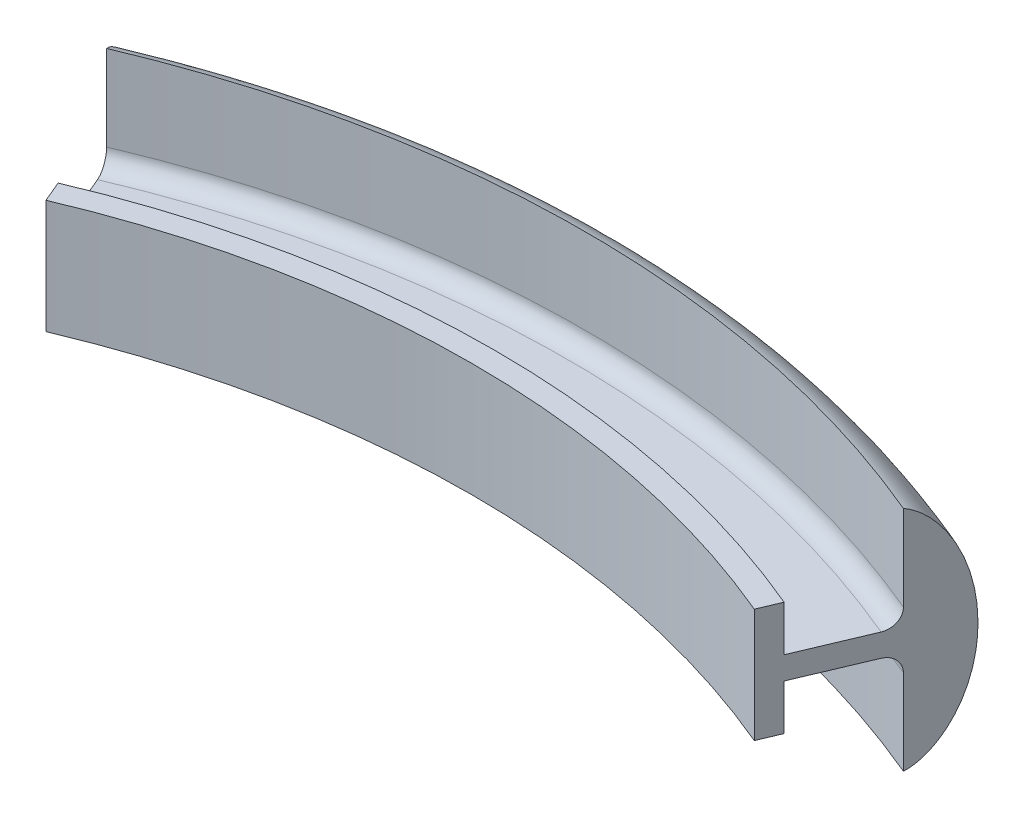
ISO-10303-21;
HEADER;
FILE_DESCRIPTION(('STEP AP214'),'2;1');
FILE_NAME('part.step','',(''),(''),'','','');
FILE_SCHEMA(('AUTOMOTIVE_DESIGN { 1 0 10303 214 1 1 1 1 }'));
ENDSEC;
DATA;
#1=APPLICATION_CONTEXT('core data for automotive mechanical design processes');
#2=APPLICATION_PROTOCOL_DEFINITION('international standard','automotive_design',2000,#1);
#3=PRODUCT_CONTEXT('',#1,'mechanical');
#4=PRODUCT('Part','Part','',(#3));
#5=PRODUCT_RELATED_PRODUCT_CATEGORY('part','',(#4));
#6=PRODUCT_DEFINITION_FORMATION('','',#4);
#7=PRODUCT_DEFINITION_CONTEXT('part definition',#1,'design');
#8=PRODUCT_DEFINITION('design','',#6,#7);
#9=PRODUCT_DEFINITION_SHAPE('','',#8);
#10=(LENGTH_UNIT() NAMED_UNIT(*) SI_UNIT(.MILLI.,.METRE.));
#11=(NAMED_UNIT(*) PLANE_ANGLE_UNIT() SI_UNIT($,.RADIAN.));
#12=(NAMED_UNIT(*) SI_UNIT($,.STERADIAN.) SOLID_ANGLE_UNIT());
#13=UNCERTAINTY_MEASURE_WITH_UNIT(LENGTH_MEASURE(1.E-05),#10,'distance_accuracy_value','');
#14=(GEOMETRIC_REPRESENTATION_CONTEXT(3) GLOBAL_UNCERTAINTY_ASSIGNED_CONTEXT((#13)) GLOBAL_UNIT_ASSIGNED_CONTEXT((#10,
#11,#12)) REPRESENTATION_CONTEXT('',''));
#15=CARTESIAN_POINT('',(0.,0.,0.));
#16=DIRECTION('',(0.,0.,1.));
#17=DIRECTION('',(1.,0.,0.));
#18=AXIS2_PLACEMENT_3D('',#15,#16,#17);
#19=CARTESIAN_POINT('',(-31.8888888888889,0.999999999999999,14.4546575530159));
#20=DIRECTION('',(0.,1.,0.));
#21=DIRECTION('',(0.,0.,1.));
#22=AXIS2_PLACEMENT_3D('',#19,#20,#21);
#23=PLANE('',#22);
#24=CARTESIAN_POINT('',(0.,0.999999999999998,90.));
#25=DIRECTION('',(0.,-1.,0.));
#26=DIRECTION('',(0.,0.,-1.));
#27=AXIS2_PLACEMENT_3D('',#24,#25,#26);
#28=CIRCLE('',#27,82.);
#29=CARTESIAN_POINT('',(-31.8888888888889,0.999999999999998,14.4546575530159));
#30=VERTEX_POINT('',#29);
#31=CARTESIAN_POINT('',(31.8888888888889,0.999999999999998,14.4546575530159));
#32=VERTEX_POINT('',#31);
#33=EDGE_CURVE('E12',#30,#32,#28,.T.);
#34=ORIENTED_EDGE('',*,*,#33,.T.);
#35=DIRECTION('',(-0.388888888888889,0.,0.921284663987611));
#36=VECTOR('',#35,1.);
#37=CARTESIAN_POINT('',(31.8888888888889,0.999999999999998,14.4546575530159));
#38=LINE('',#37,#36);
#39=CARTESIAN_POINT('',(34.4166666666667,0.999999999999999,8.46630723709643));
#40=VERTEX_POINT('',#39);
#41=EDGE_CURVE('E129',#40,#32,#38,.T.);
#42=ORIENTED_EDGE('',*,*,#41,.F.);
#43=CARTESIAN_POINT('',(0.,0.999999999999999,90.));
#44=DIRECTION('',(0.,-1.,0.));
#45=DIRECTION('',(0.,0.,-1.));
#46=AXIS2_PLACEMENT_3D('',#43,#44,#45);
#47=CIRCLE('',#46,88.5);
#48=CARTESIAN_POINT('',(-34.4166666666667,0.999999999999999,8.46630723709643));
#49=VERTEX_POINT('',#48);
#50=EDGE_CURVE('E50',#49,#40,#47,.T.);
#51=ORIENTED_EDGE('',*,*,#50,.F.);
#52=DIRECTION('',(0.388888888888889,0.,0.921284663987611));
#53=VECTOR('',#52,1.);
#54=CARTESIAN_POINT('',(-31.8888888888889,0.999999999999998,14.4546575530159));
#55=LINE('',#54,#53);
#56=EDGE_CURVE('E131',#49,#30,#55,.T.);
#57=ORIENTED_EDGE('',*,*,#56,.T.);
#58=EDGE_LOOP('',(#34,#42,#51,#57));
#59=FACE_BOUND('',#58,.T.);
#60=ADVANCED_FACE('F35',(#59),#23,.T.);
#61=CARTESIAN_POINT('',(0.,0.,90.));
#62=DIRECTION('',(0.,-1.,0.));
#63=DIRECTION('',(0.,0.,-1.));
#64=AXIS2_PLACEMENT_3D('',#61,#62,#63);
#65=CYLINDRICAL_SURFACE('',#64,82.);
#66=CARTESIAN_POINT('',(0.,5.,90.));
#67=DIRECTION('',(0.,-1.,0.));
#68=DIRECTION('',(0.,0.,-1.));
#69=AXIS2_PLACEMENT_3D('',#66,#67,#68);
#70=CIRCLE('',#69,82.);
#71=CARTESIAN_POINT('',(-31.8888888888889,5.,14.4546575530159));
#72=VERTEX_POINT('',#71);
#73=CARTESIAN_POINT('',(31.8888888888889,5.,14.4546575530159));
#74=VERTEX_POINT('',#73);
#75=EDGE_CURVE('E43',#72,#74,#70,.T.);
#76=ORIENTED_EDGE('',*,*,#75,.T.);
#77=DIRECTION('',(0.,1.,0.));
#78=VECTOR('',#77,1.);
#79=CARTESIAN_POINT('',(31.8888888888889,5.,14.4546575530159));
#80=LINE('',#79,#78);
#81=EDGE_CURVE('E140',#32,#74,#80,.T.);
#82=ORIENTED_EDGE('',*,*,#81,.F.);
#83=ORIENTED_EDGE('',*,*,#33,.F.);
#84=DIRECTION('',(0.,1.,0.));
#85=VECTOR('',#84,1.);
#86=CARTESIAN_POINT('',(-31.8888888888889,5.,14.4546575530159));
#87=LINE('',#86,#85);
#88=EDGE_CURVE('E187',#30,#72,#87,.T.);
#89=ORIENTED_EDGE('',*,*,#88,.T.);
#90=EDGE_LOOP('',(#76,#82,#83,#89));
#91=FACE_BOUND('',#90,.T.);
#92=ADVANCED_FACE('F37',(#91),#65,.T.);
#93=CARTESIAN_POINT('',(-31.1111111111111,5.,16.2972268809911));
#94=DIRECTION('',(0.,1.,0.));
#95=DIRECTION('',(0.,0.,1.));
#96=AXIS2_PLACEMENT_3D('',#93,#94,#95);
#97=PLANE('',#96);
#98=CARTESIAN_POINT('',(0.,5.,90.));
#99=DIRECTION('',(0.,-1.,0.));
#100=DIRECTION('',(0.,0.,-1.));
#101=AXIS2_PLACEMENT_3D('',#98,#99,#100);
#102=CIRCLE('',#101,80.);
#103=CARTESIAN_POINT('',(-31.1111111111111,5.,16.2972268809911));
#104=VERTEX_POINT('',#103);
#105=CARTESIAN_POINT('',(31.1111111111111,5.,16.2972268809911));
#106=VERTEX_POINT('',#105);
#107=EDGE_CURVE('E304',#104,#106,#102,.T.);
#108=ORIENTED_EDGE('',*,*,#107,.T.);
#109=DIRECTION('',(-0.388888888888889,0.,0.921284663987611));
#110=VECTOR('',#109,1.);
#111=CARTESIAN_POINT('',(31.1111111111111,5.,16.2972268809911));
#112=LINE('',#111,#110);
#113=EDGE_CURVE('E145',#74,#106,#112,.T.);
#114=ORIENTED_EDGE('',*,*,#113,.F.);
#115=ORIENTED_EDGE('',*,*,#75,.F.);
#116=DIRECTION('',(0.388888888888889,0.,0.921284663987611));
#117=VECTOR('',#116,1.);
#118=CARTESIAN_POINT('',(-31.1111111111111,5.,16.2972268809911));
#119=LINE('',#118,#117);
#120=EDGE_CURVE('E189',#72,#104,#119,.T.);
#121=ORIENTED_EDGE('',*,*,#120,.T.);
#122=EDGE_LOOP('',(#108,#114,#115,#121));
#123=FACE_BOUND('',#122,.T.);
#124=ADVANCED_FACE('F254',(#123),#97,.T.);
#125=CARTESIAN_POINT('',(0.,0.,90.));
#126=DIRECTION('',(0.,-1.,0.));
#127=DIRECTION('',(0.,0.,-1.));
#128=AXIS2_PLACEMENT_3D('',#125,#126,#127);
#129=CYLINDRICAL_SURFACE('',#128,80.);
#130=CARTESIAN_POINT('',(0.,-5.,90.));
#131=DIRECTION('',(0.,-1.,0.));
#132=DIRECTION('',(0.,0.,-1.));
#133=AXIS2_PLACEMENT_3D('',#130,#131,#132);
#134=CIRCLE('',#133,80.);
#135=CARTESIAN_POINT('',(-31.1111111111111,-5.,16.2972268809911));
#136=VERTEX_POINT('',#135);
#137=CARTESIAN_POINT('',(31.1111111111111,-5.,16.2972268809911));
#138=VERTEX_POINT('',#137);
#139=EDGE_CURVE('E302',#136,#138,#134,.T.);
#140=ORIENTED_EDGE('',*,*,#139,.T.);
#141=DIRECTION('',(0.,-1.,0.));
#142=VECTOR('',#141,1.);
#143=CARTESIAN_POINT('',(31.1111111111111,-5.,16.2972268809911));
#144=LINE('',#143,#142);
#145=EDGE_CURVE('E147',#106,#138,#144,.T.);
#146=ORIENTED_EDGE('',*,*,#145,.F.);
#147=ORIENTED_EDGE('',*,*,#107,.F.);
#148=DIRECTION('',(0.,-1.,0.));
#149=VECTOR('',#148,1.);
#150=CARTESIAN_POINT('',(-31.1111111111111,-5.,16.2972268809911));
#151=LINE('',#150,#149);
#152=EDGE_CURVE('E192',#104,#136,#151,.T.);
#153=ORIENTED_EDGE('',*,*,#152,.T.);
#154=EDGE_LOOP('',(#140,#146,#147,#153));
#155=FACE_BOUND('',#154,.T.);
#156=ADVANCED_FACE('F251',(#155),#129,.F.);
#157=CARTESIAN_POINT('',(-31.1111111111111,-5.,16.2972268809911));
#158=DIRECTION('',(0.,-1.,0.));
#159=DIRECTION('',(0.,0.,-1.));
#160=AXIS2_PLACEMENT_3D('',#157,#158,#159);
#161=PLANE('',#160);
#162=CARTESIAN_POINT('',(0.,-5.,90.));
#163=DIRECTION('',(0.,-1.,0.));
#164=DIRECTION('',(0.,0.,-1.));
#165=AXIS2_PLACEMENT_3D('',#162,#163,#164);
#166=CIRCLE('',#165,82.);
#167=CARTESIAN_POINT('',(-31.8888888888889,-5.,14.4546575530159));
#168=VERTEX_POINT('',#167);
#169=CARTESIAN_POINT('',(31.8888888888889,-5.,14.4546575530159));
#170=VERTEX_POINT('',#169);
#171=EDGE_CURVE('E300',#168,#170,#166,.T.);
#172=ORIENTED_EDGE('',*,*,#171,.T.);
#173=DIRECTION('',(0.388888888888889,0.,-0.921284663987611));
#174=VECTOR('',#173,1.);
#175=CARTESIAN_POINT('',(31.1111111111111,-5.,16.2972268809911));
#176=LINE('',#175,#174);
#177=EDGE_CURVE('E152',#138,#170,#176,.T.);
#178=ORIENTED_EDGE('',*,*,#177,.F.);
#179=ORIENTED_EDGE('',*,*,#139,.F.);
#180=DIRECTION('',(-0.388888888888889,0.,-0.921284663987611));
#181=VECTOR('',#180,1.);
#182=CARTESIAN_POINT('',(-31.1111111111111,-5.,16.2972268809911));
#183=LINE('',#182,#181);
#184=EDGE_CURVE('E195',#136,#168,#183,.T.);
#185=ORIENTED_EDGE('',*,*,#184,.T.);
#186=EDGE_LOOP('',(#172,#178,#179,#185));
#187=FACE_BOUND('',#186,.T.);
#188=ADVANCED_FACE('F247',(#187),#161,.T.);
#189=CARTESIAN_POINT('',(0.,0.,90.));
#190=DIRECTION('',(0.,-1.,0.));
#191=DIRECTION('',(0.,0.,-1.));
#192=AXIS2_PLACEMENT_3D('',#189,#190,#191);
#193=CYLINDRICAL_SURFACE('',#192,82.);
#194=CARTESIAN_POINT('',(0.,-1.,90.));
#195=DIRECTION('',(0.,-1.,0.));
#196=DIRECTION('',(0.,0.,-1.));
#197=AXIS2_PLACEMENT_3D('',#194,#195,#196);
#198=CIRCLE('',#197,82.);
#199=CARTESIAN_POINT('',(-31.8888888888889,-1.,14.4546575530159));
#200=VERTEX_POINT('',#199);
#201=CARTESIAN_POINT('',(31.8888888888889,-1.,14.4546575530159));
#202=VERTEX_POINT('',#201);
#203=EDGE_CURVE('E298',#200,#202,#198,.T.);
#204=ORIENTED_EDGE('',*,*,#203,.T.);
#205=DIRECTION('',(0.,1.,0.));
#206=VECTOR('',#205,1.);
#207=CARTESIAN_POINT('',(31.8888888888889,-5.,14.4546575530159));
#208=LINE('',#207,#206);
#209=EDGE_CURVE('E155',#170,#202,#208,.T.);
#210=ORIENTED_EDGE('',*,*,#209,.F.);
#211=ORIENTED_EDGE('',*,*,#171,.F.);
#212=DIRECTION('',(0.,1.,0.));
#213=VECTOR('',#212,1.);
#214=CARTESIAN_POINT('',(-31.8888888888889,-5.,14.4546575530159));
#215=LINE('',#214,#213);
#216=EDGE_CURVE('E198',#168,#200,#215,.T.);
#217=ORIENTED_EDGE('',*,*,#216,.T.);
#218=EDGE_LOOP('',(#204,#210,#211,#217));
#219=FACE_BOUND('',#218,.T.);
#220=ADVANCED_FACE('F243',(#219),#193,.T.);
#221=CARTESIAN_POINT('',(-31.8888888888889,-1.,14.4546575530159));
#222=DIRECTION('',(0.,-1.,0.));
#223=DIRECTION('',(0.,0.,-1.));
#224=AXIS2_PLACEMENT_3D('',#221,#222,#223);
#225=PLANE('',#224);
#226=CARTESIAN_POINT('',(0.,-0.999999999999999,90.));
#227=DIRECTION('',(0.,-1.,0.));
#228=DIRECTION('',(0.,0.,-1.));
#229=AXIS2_PLACEMENT_3D('',#226,#227,#228);
#230=CIRCLE('',#229,88.5);
#231=CARTESIAN_POINT('',(-34.4166666666667,-0.999999999999999,8.46630723709643));
#232=VERTEX_POINT('',#231);
#233=CARTESIAN_POINT('',(34.4166666666667,-0.999999999999999,8.46630723709643));
#234=VERTEX_POINT('',#233);
#235=EDGE_CURVE('E296',#232,#234,#230,.T.);
#236=ORIENTED_EDGE('',*,*,#235,.T.);
#237=DIRECTION('',(0.388888888888889,0.,-0.921284663987611));
#238=VECTOR('',#237,1.);
#239=CARTESIAN_POINT('',(31.8888888888889,-1.,14.4546575530159));
#240=LINE('',#239,#238);
#241=EDGE_CURVE('E158',#202,#234,#240,.T.);
#242=ORIENTED_EDGE('',*,*,#241,.F.);
#243=ORIENTED_EDGE('',*,*,#203,.F.);
#244=DIRECTION('',(-0.388888888888889,0.,-0.921284663987611));
#245=VECTOR('',#244,1.);
#246=CARTESIAN_POINT('',(-31.8888888888889,-1.,14.4546575530159));
#247=LINE('',#246,#245);
#248=EDGE_CURVE('E201',#200,#232,#247,.T.);
#249=ORIENTED_EDGE('',*,*,#248,.T.);
#250=EDGE_LOOP('',(#236,#242,#243,#249));
#251=FACE_BOUND('',#250,.T.);
#252=ADVANCED_FACE('F239',(#251),#225,.T.);
#253=CARTESIAN_POINT('',(0.,-2.5,90.));
#254=DIRECTION('',(0.,-1.,0.));
#255=DIRECTION('',(0.,0.,-1.));
#256=AXIS2_PLACEMENT_3D('',#253,#254,#255);
#257=TOROIDAL_SURFACE('',#256,88.5,1.5);
#258=CARTESIAN_POINT('',(0.,-2.50000000000001,90.));
#259=DIRECTION('',(0.,-1.,0.));
#260=DIRECTION('',(0.,0.,-1.));
#261=AXIS2_PLACEMENT_3D('',#258,#259,#260);
#262=CIRCLE('',#261,90.);
#263=CARTESIAN_POINT('',(-35.,-2.50000000000001,7.08438024111501));
#264=VERTEX_POINT('',#263);
#265=CARTESIAN_POINT('',(35.,-2.50000000000001,7.08438024111501));
#266=VERTEX_POINT('',#265);
#267=EDGE_CURVE('E294',#264,#266,#262,.T.);
#268=ORIENTED_EDGE('',*,*,#267,.T.);
#269=CARTESIAN_POINT('',(34.4166666666667,-2.5,8.46630723709642));
#270=DIRECTION('',(-0.921284663987611,0.,-0.388888888888889));
#271=DIRECTION('',(-0.388888888888889,0.,0.921284663987611));
#272=AXIS2_PLACEMENT_3D('',#269,#270,#271);
#273=CIRCLE('',#272,1.5);
#274=EDGE_CURVE('E161',#234,#266,#273,.T.);
#275=ORIENTED_EDGE('',*,*,#274,.F.);
#276=ORIENTED_EDGE('',*,*,#235,.F.);
#277=CARTESIAN_POINT('',(-34.4166666666667,-2.5,8.46630723709642));
#278=DIRECTION('',(-0.921284663987611,0.,0.388888888888889));
#279=DIRECTION('',(0.388888888888889,0.,0.921284663987611));
#280=AXIS2_PLACEMENT_3D('',#277,#278,#279);
#281=CIRCLE('',#280,1.5);
#282=EDGE_CURVE('E204',#232,#264,#281,.T.);
#283=ORIENTED_EDGE('',*,*,#282,.T.);
#284=EDGE_LOOP('',(#268,#275,#276,#283));
#285=FACE_BOUND('',#284,.T.);
#286=ADVANCED_FACE('F235',(#285),#257,.F.);
#287=CARTESIAN_POINT('',(0.,0.,90.));
#288=DIRECTION('',(0.,-1.,0.));
#289=DIRECTION('',(0.,0.,-1.));
#290=AXIS2_PLACEMENT_3D('',#287,#288,#289);
#291=CYLINDRICAL_SURFACE('',#290,90.);
#292=CARTESIAN_POINT('',(0.,-10.,90.));
#293=DIRECTION('',(0.,-1.,0.));
#294=DIRECTION('',(0.,0.,-1.));
#295=AXIS2_PLACEMENT_3D('',#292,#293,#294);
#296=CIRCLE('',#295,90.);
#297=CARTESIAN_POINT('',(-35.,-10.,7.08438024111501));
#298=VERTEX_POINT('',#297);
#299=CARTESIAN_POINT('',(35.,-10.,7.08438024111501));
#300=VERTEX_POINT('',#299);
#301=EDGE_CURVE('E292',#298,#300,#296,.T.);
#302=ORIENTED_EDGE('',*,*,#301,.T.);
#303=DIRECTION('',(0.,-1.,0.));
#304=VECTOR('',#303,1.);
#305=CARTESIAN_POINT('',(35.,-2.50000000000001,7.08438024111501));
#306=LINE('',#305,#304);
#307=EDGE_CURVE('E164',#266,#300,#306,.T.);
#308=ORIENTED_EDGE('',*,*,#307,.F.);
#309=ORIENTED_EDGE('',*,*,#267,.F.);
#310=DIRECTION('',(0.,-1.,0.));
#311=VECTOR('',#310,1.);
#312=CARTESIAN_POINT('',(-35.,-2.50000000000001,7.08438024111501));
#313=LINE('',#312,#311);
#314=EDGE_CURVE('E207',#264,#298,#313,.T.);
#315=ORIENTED_EDGE('',*,*,#314,.T.);
#316=EDGE_LOOP('',(#302,#308,#309,#315));
#317=FACE_BOUND('',#316,.T.);
#318=ADVANCED_FACE('F230',(#317),#291,.F.);
#319=CARTESIAN_POINT('',(-35.,-10.,7.08438024111501));
#320=CARTESIAN_POINT('',(-35.8853282350696,-9.23157045329078,4.98702197537683));
#321=CARTESIAN_POINT('',(-36.9444444444444,-5.39648036820952,2.47795692117695));
#322=CARTESIAN_POINT('',(-36.9444444444444,0.,2.47795692117695));
#323=B_SPLINE_CURVE_WITH_KNOTS('',3,(#319,#320,#321,#322),.UNSPECIFIED.,.F.,.F.,(4,4),(0.,1.),.UNSPECIFIED.);
#324=CARTESIAN_POINT('',(0.,0.,90.));
#325=DIRECTION('',(0.,-1.,0.));
#326=AXIS1_PLACEMENT('',#324,#325);
#327=SURFACE_OF_REVOLUTION('',#323,#326);
#328=CARTESIAN_POINT('',(0.,0.,90.));
#329=DIRECTION('',(0.,-1.,0.));
#330=DIRECTION('',(0.,0.,-1.));
#331=AXIS2_PLACEMENT_3D('',#328,#329,#330);
#332=CIRCLE('',#331,95.);
#333=CARTESIAN_POINT('',(-36.9444444444444,0.,2.47795692117695));
#334=VERTEX_POINT('',#333);
#335=CARTESIAN_POINT('',(36.9444444444444,0.,2.47795692117695));
#336=VERTEX_POINT('',#335);
#337=EDGE_CURVE('E290',#334,#336,#332,.T.);
#338=ORIENTED_EDGE('',*,*,#337,.T.);
#339=CARTESIAN_POINT('',(35.,-10.,7.08438024111501));
#340=CARTESIAN_POINT('',(35.8853282350696,-9.23157045329078,4.98702197537683));
#341=CARTESIAN_POINT('',(36.9444444444444,-5.39648036820952,2.47795692117695));
#342=CARTESIAN_POINT('',(36.9444444444444,0.,2.47795692117695));
#343=B_SPLINE_CURVE_WITH_KNOTS('',3,(#339,#340,#341,#342),.UNSPECIFIED.,.F.,.F.,(4,4),(0.,1.),.UNSPECIFIED.);
#344=EDGE_CURVE('E167',#300,#336,#343,.T.);
#345=ORIENTED_EDGE('',*,*,#344,.F.);
#346=ORIENTED_EDGE('',*,*,#301,.F.);
#347=EDGE_CURVE('E210',#298,#334,#323,.T.);
#348=ORIENTED_EDGE('',*,*,#347,.T.);
#349=EDGE_LOOP('',(#338,#345,#346,#348));
#350=FACE_BOUND('',#349,.T.);
#351=ADVANCED_FACE('F225',(#350),#327,.F.);
#352=CARTESIAN_POINT('',(-36.9444444444444,0.,2.47795692117695));
#353=CARTESIAN_POINT('',(-36.9444444444444,5.39648036820952,2.47795692117695));
#354=CARTESIAN_POINT('',(-35.8853282350696,9.23157045329078,4.98702197537683));
#355=CARTESIAN_POINT('',(-35.,10.,7.08438024111501));
#356=B_SPLINE_CURVE_WITH_KNOTS('',3,(#352,#353,#354,#355),.UNSPECIFIED.,.F.,.F.,(4,4),(0.,1.),.UNSPECIFIED.);
#357=CARTESIAN_POINT('',(0.,0.,90.));
#358=DIRECTION('',(0.,-1.,0.));
#359=AXIS1_PLACEMENT('',#357,#358);
#360=SURFACE_OF_REVOLUTION('',#356,#359);
#361=CARTESIAN_POINT('',(0.,10.,90.));
#362=DIRECTION('',(0.,-1.,0.));
#363=DIRECTION('',(0.,0.,-1.));
#364=AXIS2_PLACEMENT_3D('',#361,#362,#363);
#365=CIRCLE('',#364,90.);
#366=CARTESIAN_POINT('',(-35.,10.,7.08438024111501));
#367=VERTEX_POINT('',#366);
#368=CARTESIAN_POINT('',(35.,10.,7.08438024111501));
#369=VERTEX_POINT('',#368);
#370=EDGE_CURVE('E282',#367,#369,#365,.T.);
#371=ORIENTED_EDGE('',*,*,#370,.T.);
#372=CARTESIAN_POINT('',(36.9444444444444,0.,2.47795692117695));
#373=CARTESIAN_POINT('',(36.9444444444444,5.39648036820952,2.47795692117695));
#374=CARTESIAN_POINT('',(35.8853282350696,9.23157045329078,4.98702197537683));
#375=CARTESIAN_POINT('',(35.,10.,7.08438024111501));
#376=B_SPLINE_CURVE_WITH_KNOTS('',3,(#372,#373,#374,#375),.UNSPECIFIED.,.F.,.F.,(4,4),(0.,1.),.UNSPECIFIED.);
#377=EDGE_CURVE('E172',#336,#369,#376,.T.);
#378=ORIENTED_EDGE('',*,*,#377,.F.);
#379=ORIENTED_EDGE('',*,*,#337,.F.);
#380=EDGE_CURVE('E216',#334,#367,#356,.T.);
#381=ORIENTED_EDGE('',*,*,#380,.T.);
#382=EDGE_LOOP('',(#371,#378,#379,#381));
#383=FACE_BOUND('',#382,.T.);
#384=ADVANCED_FACE('F229',(#383),#360,.F.);
#385=CARTESIAN_POINT('',(0.,0.,90.));
#386=DIRECTION('',(0.,-1.,0.));
#387=DIRECTION('',(0.,0.,-1.));
#388=AXIS2_PLACEMENT_3D('',#385,#386,#387);
#389=CYLINDRICAL_SURFACE('',#388,90.);
#390=CARTESIAN_POINT('',(0.,2.50000000000001,90.));
#391=DIRECTION('',(0.,-1.,0.));
#392=DIRECTION('',(0.,0.,-1.));
#393=AXIS2_PLACEMENT_3D('',#390,#391,#392);
#394=CIRCLE('',#393,90.);
#395=CARTESIAN_POINT('',(-35.,2.50000000000001,7.08438024111501));
#396=VERTEX_POINT('',#395);
#397=CARTESIAN_POINT('',(35.,2.50000000000001,7.08438024111501));
#398=VERTEX_POINT('',#397);
#399=EDGE_CURVE('E58',#396,#398,#394,.T.);
#400=ORIENTED_EDGE('',*,*,#399,.T.);
#401=DIRECTION('',(0.,-1.,0.));
#402=VECTOR('',#401,1.);
#403=CARTESIAN_POINT('',(35.,2.50000000000001,7.08438024111501));
#404=LINE('',#403,#402);
#405=EDGE_CURVE('E180',#369,#398,#404,.T.);
#406=ORIENTED_EDGE('',*,*,#405,.F.);
#407=ORIENTED_EDGE('',*,*,#370,.F.);
#408=DIRECTION('',(0.,-1.,0.));
#409=VECTOR('',#408,1.);
#410=CARTESIAN_POINT('',(-35.,2.50000000000001,7.08438024111501));
#411=LINE('',#410,#409);
#412=EDGE_CURVE('E280',#367,#396,#411,.T.);
#413=ORIENTED_EDGE('',*,*,#412,.T.);
#414=EDGE_LOOP('',(#400,#406,#407,#413));
#415=FACE_BOUND('',#414,.T.);
#416=ADVANCED_FACE('F271',(#415),#389,.F.);
#417=CARTESIAN_POINT('',(0.,2.5,90.));
#418=DIRECTION('',(0.,-1.,0.));
#419=DIRECTION('',(0.,0.,-1.));
#420=AXIS2_PLACEMENT_3D('',#417,#418,#419);
#421=TOROIDAL_SURFACE('',#420,88.5,1.5);
#422=CARTESIAN_POINT('',(-34.4166666666667,2.5,8.46630723709642));
#423=DIRECTION('',(-0.921284663987611,0.,0.388888888888889));
#424=DIRECTION('',(-0.388888888888889,0.,-0.921284663987611));
#425=AXIS2_PLACEMENT_3D('',#422,#423,#424);
#426=CIRCLE('',#425,1.5);
#427=EDGE_CURVE('E285',#396,#49,#426,.T.);
#428=ORIENTED_EDGE('',*,*,#427,.T.);
#429=ORIENTED_EDGE('',*,*,#50,.T.);
#430=CARTESIAN_POINT('',(34.4166666666667,2.5,8.46630723709642));
#431=DIRECTION('',(-0.921284663987611,0.,-0.388888888888889));
#432=DIRECTION('',(0.388888888888889,0.,-0.921284663987611));
#433=AXIS2_PLACEMENT_3D('',#430,#431,#432);
#434=CIRCLE('',#433,1.5);
#435=EDGE_CURVE('E143',#398,#40,#434,.T.);
#436=ORIENTED_EDGE('',*,*,#435,.F.);
#437=ORIENTED_EDGE('',*,*,#399,.F.);
#438=EDGE_LOOP('',(#428,#429,#436,#437));
#439=FACE_BOUND('',#438,.T.);
#440=ADVANCED_FACE('F269',(#439),#421,.F.);
#441=CARTESIAN_POINT('',(-34.4166666666667,2.5,8.46630723709642));
#442=DIRECTION('',(0.921284663987611,0.,-0.388888888888889));
#443=DIRECTION('',(-0.388888888888889,0.,-0.921284663987611));
#444=AXIS2_PLACEMENT_3D('',#441,#442,#443);
#445=PLANE('',#444);
#446=ORIENTED_EDGE('',*,*,#56,.F.);
#447=ORIENTED_EDGE('',*,*,#427,.F.);
#448=ORIENTED_EDGE('',*,*,#412,.F.);
#449=ORIENTED_EDGE('',*,*,#380,.F.);
#450=ORIENTED_EDGE('',*,*,#347,.F.);
#451=ORIENTED_EDGE('',*,*,#314,.F.);
#452=ORIENTED_EDGE('',*,*,#282,.F.);
#453=ORIENTED_EDGE('',*,*,#248,.F.);
#454=ORIENTED_EDGE('',*,*,#216,.F.);
#455=ORIENTED_EDGE('',*,*,#184,.F.);
#456=ORIENTED_EDGE('',*,*,#152,.F.);
#457=ORIENTED_EDGE('',*,*,#120,.F.);
#458=ORIENTED_EDGE('',*,*,#88,.F.);
#459=EDGE_LOOP('',(#446,#447,#448,#449,#450,#451,#452,#453,#454,#455,#456,#457,#458));
#460=FACE_BOUND('',#459,.T.);
#461=ADVANCED_FACE('F267',(#460),#445,.F.);
#462=CARTESIAN_POINT('',(34.4166666666667,2.5,8.46630723709642));
#463=DIRECTION('',(0.921284663987611,0.,0.388888888888889));
#464=DIRECTION('',(0.388888888888889,0.,-0.921284663987611));
#465=AXIS2_PLACEMENT_3D('',#462,#463,#464);
#466=PLANE('',#465);
#467=ORIENTED_EDGE('',*,*,#41,.T.);
#468=ORIENTED_EDGE('',*,*,#81,.T.);
#469=ORIENTED_EDGE('',*,*,#113,.T.);
#470=ORIENTED_EDGE('',*,*,#145,.T.);
#471=ORIENTED_EDGE('',*,*,#177,.T.);
#472=ORIENTED_EDGE('',*,*,#209,.T.);
#473=ORIENTED_EDGE('',*,*,#241,.T.);
#474=ORIENTED_EDGE('',*,*,#274,.T.);
#475=ORIENTED_EDGE('',*,*,#307,.T.);
#476=ORIENTED_EDGE('',*,*,#344,.T.);
#477=ORIENTED_EDGE('',*,*,#377,.T.);
#478=ORIENTED_EDGE('',*,*,#405,.T.);
#479=ORIENTED_EDGE('',*,*,#435,.T.);
#480=EDGE_LOOP('',(#467,#468,#469,#470,#471,#472,#473,#474,#475,#476,#477,#478,#479));
#481=FACE_BOUND('',#480,.T.);
#482=ADVANCED_FACE('F138',(#481),#466,.T.);
#483=CLOSED_SHELL('',(#60,#92,#124,#156,#188,#220,#252,#286,#318,#351,#384,#416,#440,#461,#482));
#484=MANIFOLD_SOLID_BREP('B2',#483);
#485=ADVANCED_BREP_SHAPE_REPRESENTATION('',(#18,#484),#14);
#486=SHAPE_DEFINITION_REPRESENTATION(#9,#485);
ENDSEC;
END-ISO-10303-21;
